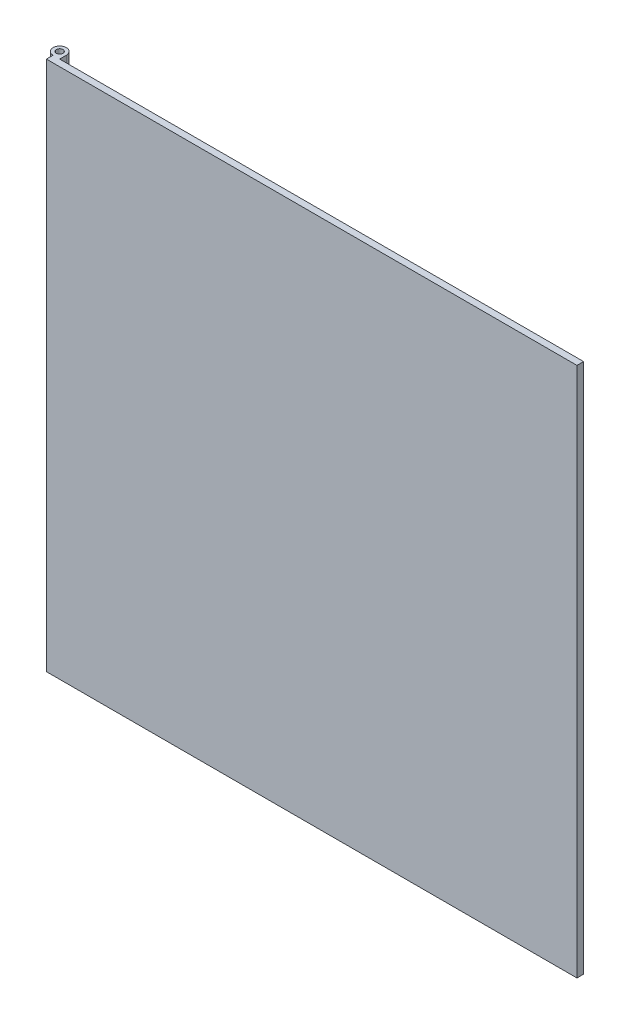
ISO-10303-21;
HEADER;
FILE_DESCRIPTION(('STEP AP214'),'2;1');
FILE_NAME('part.step','',(''),(''),'','','');
FILE_SCHEMA(('AUTOMOTIVE_DESIGN { 1 0 10303 214 1 1 1 1 }'));
ENDSEC;
DATA;
#1=APPLICATION_CONTEXT('core data for automotive mechanical design processes');
#2=APPLICATION_PROTOCOL_DEFINITION('international standard','automotive_design',2000,#1);
#3=PRODUCT_CONTEXT('',#1,'mechanical');
#4=PRODUCT('Part','Part','',(#3));
#5=PRODUCT_RELATED_PRODUCT_CATEGORY('part','',(#4));
#6=PRODUCT_DEFINITION_FORMATION('','',#4);
#7=PRODUCT_DEFINITION_CONTEXT('part definition',#1,'design');
#8=PRODUCT_DEFINITION('design','',#6,#7);
#9=PRODUCT_DEFINITION_SHAPE('','',#8);
#10=(LENGTH_UNIT() NAMED_UNIT(*) SI_UNIT(.MILLI.,.METRE.));
#11=(NAMED_UNIT(*) PLANE_ANGLE_UNIT() SI_UNIT($,.RADIAN.));
#12=(NAMED_UNIT(*) SI_UNIT($,.STERADIAN.) SOLID_ANGLE_UNIT());
#13=UNCERTAINTY_MEASURE_WITH_UNIT(LENGTH_MEASURE(1.E-05),#10,'distance_accuracy_value','');
#14=(GEOMETRIC_REPRESENTATION_CONTEXT(3) GLOBAL_UNCERTAINTY_ASSIGNED_CONTEXT((#13)) GLOBAL_UNIT_ASSIGNED_CONTEXT((#10,
#11,#12)) REPRESENTATION_CONTEXT('',''));
#15=CARTESIAN_POINT('',(0.,0.,0.));
#16=DIRECTION('',(0.,0.,1.));
#17=DIRECTION('',(1.,0.,0.));
#18=AXIS2_PLACEMENT_3D('',#15,#16,#17);
#19=CARTESIAN_POINT('',(0.,0.,1.));
#20=DIRECTION('',(1.,0.,0.));
#21=DIRECTION('',(0.,0.,-1.));
#22=AXIS2_PLACEMENT_3D('',#19,#20,#21);
#23=PLANE('',#22);
#24=DIRECTION('',(0.,-1.,0.));
#25=VECTOR('',#24,1.);
#26=CARTESIAN_POINT('',(0.,0.,0.));
#27=LINE('',#26,#25);
#28=CARTESIAN_POINT('',(0.,80.,0.));
#29=VERTEX_POINT('',#28);
#30=CARTESIAN_POINT('',(0.,0.,0.));
#31=VERTEX_POINT('',#30);
#32=EDGE_CURVE('E98',#29,#31,#27,.T.);
#33=ORIENTED_EDGE('',*,*,#32,.T.);
#34=DIRECTION('',(0.,0.,-1.));
#35=VECTOR('',#34,1.);
#36=CARTESIAN_POINT('',(0.,0.,1.));
#37=LINE('',#36,#35);
#38=CARTESIAN_POINT('',(0.,0.,1.));
#39=VERTEX_POINT('',#38);
#40=EDGE_CURVE('E11',#39,#31,#37,.T.);
#41=ORIENTED_EDGE('',*,*,#40,.F.);
#42=DIRECTION('',(0.,-1.,0.));
#43=VECTOR('',#42,1.);
#44=CARTESIAN_POINT('',(0.,0.,1.));
#45=LINE('',#44,#43);
#46=CARTESIAN_POINT('',(0.,80.,1.));
#47=VERTEX_POINT('',#46);
#48=EDGE_CURVE('E120',#47,#39,#45,.T.);
#49=ORIENTED_EDGE('',*,*,#48,.F.);
#50=DIRECTION('',(0.,0.,-1.));
#51=VECTOR('',#50,1.);
#52=CARTESIAN_POINT('',(0.,80.,1.));
#53=LINE('',#52,#51);
#54=EDGE_CURVE('E115',#47,#29,#53,.T.);
#55=ORIENTED_EDGE('',*,*,#54,.T.);
#56=EDGE_LOOP('',(#33,#41,#49,#55));
#57=FACE_BOUND('',#56,.T.);
#58=ADVANCED_FACE('F35',(#57),#23,.F.);
#59=CARTESIAN_POINT('',(0.,0.,1.));
#60=DIRECTION('',(0.,1.,0.));
#61=DIRECTION('',(0.,0.,1.));
#62=AXIS2_PLACEMENT_3D('',#59,#60,#61);
#63=PLANE('',#62);
#64=ORIENTED_EDGE('',*,*,#40,.T.);
#65=CARTESIAN_POINT('',(0.,0.,-1.));
#66=DIRECTION('',(0.,1.,0.));
#67=DIRECTION('',(0.,0.,1.));
#68=AXIS2_PLACEMENT_3D('',#65,#66,#67);
#69=CIRCLE('',#68,1.);
#70=CARTESIAN_POINT('',(1.,0.,-1.));
#71=VERTEX_POINT('',#70);
#72=EDGE_CURVE('E104',#31,#71,#69,.F.);
#73=ORIENTED_EDGE('',*,*,#72,.T.);
#74=DIRECTION('',(0.,0.,1.));
#75=VECTOR('',#74,1.);
#76=CARTESIAN_POINT('',(1.,0.,0.));
#77=LINE('',#76,#75);
#78=CARTESIAN_POINT('',(1.,0.,0.));
#79=VERTEX_POINT('',#78);
#80=EDGE_CURVE('E145',#71,#79,#77,.T.);
#81=ORIENTED_EDGE('',*,*,#80,.T.);
#82=DIRECTION('',(1.,0.,0.));
#83=VECTOR('',#82,1.);
#84=CARTESIAN_POINT('',(0.,0.,0.));
#85=LINE('',#84,#83);
#86=CARTESIAN_POINT('',(80.,0.,0.));
#87=VERTEX_POINT('',#86);
#88=EDGE_CURVE('E108',#79,#87,#85,.T.);
#89=ORIENTED_EDGE('',*,*,#88,.T.);
#90=DIRECTION('',(0.,0.,-1.));
#91=VECTOR('',#90,1.);
#92=CARTESIAN_POINT('',(80.,0.,1.));
#93=LINE('',#92,#91);
#94=CARTESIAN_POINT('',(80.,0.,1.));
#95=VERTEX_POINT('',#94);
#96=EDGE_CURVE('E42',#95,#87,#93,.T.);
#97=ORIENTED_EDGE('',*,*,#96,.F.);
#98=DIRECTION('',(1.,0.,0.));
#99=VECTOR('',#98,1.);
#100=CARTESIAN_POINT('',(0.,0.,1.));
#101=LINE('',#100,#99);
#102=EDGE_CURVE('E81',#39,#95,#101,.T.);
#103=ORIENTED_EDGE('',*,*,#102,.F.);
#104=EDGE_LOOP('',(#64,#73,#81,#89,#97,#103));
#105=FACE_BOUND('',#104,.T.);
#106=CARTESIAN_POINT('',(0.,0.,-1.));
#107=DIRECTION('',(0.,1.,0.));
#108=DIRECTION('',(0.,0.,1.));
#109=AXIS2_PLACEMENT_3D('',#106,#107,#108);
#110=CIRCLE('',#109,0.5);
#111=CARTESIAN_POINT('',(0.,0.,-0.5));
#112=VERTEX_POINT('',#111);
#113=EDGE_CURVE('E109',#112,#112,#110,.F.);
#114=ORIENTED_EDGE('',*,*,#113,.F.);
#115=EDGE_LOOP('',(#114));
#116=FACE_BOUND('',#115,.T.);
#117=ADVANCED_FACE('F150',(#105,#116),#63,.F.);
#118=CARTESIAN_POINT('',(80.,0.,1.));
#119=DIRECTION('',(-1.,0.,0.));
#120=DIRECTION('',(0.,0.,1.));
#121=AXIS2_PLACEMENT_3D('',#118,#119,#120);
#122=PLANE('',#121);
#123=DIRECTION('',(0.,1.,0.));
#124=VECTOR('',#123,1.);
#125=CARTESIAN_POINT('',(80.,0.,0.));
#126=LINE('',#125,#124);
#127=CARTESIAN_POINT('',(80.,80.,0.));
#128=VERTEX_POINT('',#127);
#129=EDGE_CURVE('E74',#87,#128,#126,.T.);
#130=ORIENTED_EDGE('',*,*,#129,.T.);
#131=DIRECTION('',(0.,0.,-1.));
#132=VECTOR('',#131,1.);
#133=CARTESIAN_POINT('',(80.,80.,1.));
#134=LINE('',#133,#132);
#135=CARTESIAN_POINT('',(80.,80.,1.));
#136=VERTEX_POINT('',#135);
#137=EDGE_CURVE('E121',#136,#128,#134,.T.);
#138=ORIENTED_EDGE('',*,*,#137,.F.);
#139=DIRECTION('',(0.,1.,0.));
#140=VECTOR('',#139,1.);
#141=CARTESIAN_POINT('',(80.,0.,1.));
#142=LINE('',#141,#140);
#143=EDGE_CURVE('E124',#95,#136,#142,.T.);
#144=ORIENTED_EDGE('',*,*,#143,.F.);
#145=ORIENTED_EDGE('',*,*,#96,.T.);
#146=EDGE_LOOP('',(#130,#138,#144,#145));
#147=FACE_BOUND('',#146,.T.);
#148=ADVANCED_FACE('F130',(#147),#122,.F.);
#149=CARTESIAN_POINT('',(0.,80.,1.));
#150=DIRECTION('',(0.,-1.,0.));
#151=DIRECTION('',(0.,0.,-1.));
#152=AXIS2_PLACEMENT_3D('',#149,#150,#151);
#153=PLANE('',#152);
#154=DIRECTION('',(-1.,0.,0.));
#155=VECTOR('',#154,1.);
#156=CARTESIAN_POINT('',(0.,80.,0.));
#157=LINE('',#156,#155);
#158=CARTESIAN_POINT('',(1.,80.,0.));
#159=VERTEX_POINT('',#158);
#160=EDGE_CURVE('E127',#128,#159,#157,.T.);
#161=ORIENTED_EDGE('',*,*,#160,.T.);
#162=DIRECTION('',(0.,0.,-1.));
#163=VECTOR('',#162,1.);
#164=CARTESIAN_POINT('',(1.,80.,0.));
#165=LINE('',#164,#163);
#166=CARTESIAN_POINT('',(1.,80.,-1.));
#167=VERTEX_POINT('',#166);
#168=EDGE_CURVE('E117',#159,#167,#165,.T.);
#169=ORIENTED_EDGE('',*,*,#168,.T.);
#170=CARTESIAN_POINT('',(0.,80.,-1.));
#171=DIRECTION('',(0.,1.,0.));
#172=DIRECTION('',(0.,0.,-1.));
#173=AXIS2_PLACEMENT_3D('',#170,#171,#172);
#174=CIRCLE('',#173,1.);
#175=EDGE_CURVE('E102',#167,#29,#174,.T.);
#176=ORIENTED_EDGE('',*,*,#175,.T.);
#177=ORIENTED_EDGE('',*,*,#54,.F.);
#178=DIRECTION('',(-1.,0.,0.));
#179=VECTOR('',#178,1.);
#180=CARTESIAN_POINT('',(0.,80.,1.));
#181=LINE('',#180,#179);
#182=EDGE_CURVE('E58',#136,#47,#181,.T.);
#183=ORIENTED_EDGE('',*,*,#182,.F.);
#184=ORIENTED_EDGE('',*,*,#137,.T.);
#185=EDGE_LOOP('',(#161,#169,#176,#177,#183,#184));
#186=FACE_BOUND('',#185,.T.);
#187=CARTESIAN_POINT('',(0.,80.,-1.));
#188=DIRECTION('',(0.,1.,0.));
#189=DIRECTION('',(0.,0.,1.));
#190=AXIS2_PLACEMENT_3D('',#187,#188,#189);
#191=CIRCLE('',#190,0.5);
#192=CARTESIAN_POINT('',(0.,80.,-0.5));
#193=VERTEX_POINT('',#192);
#194=EDGE_CURVE('E118',#193,#193,#191,.T.);
#195=ORIENTED_EDGE('',*,*,#194,.F.);
#196=EDGE_LOOP('',(#195));
#197=FACE_BOUND('',#196,.T.);
#198=ADVANCED_FACE('F113',(#186,#197),#153,.F.);
#199=CARTESIAN_POINT('',(0.,0.,1.));
#200=DIRECTION('',(0.,0.,-1.));
#201=DIRECTION('',(-1.,0.,0.));
#202=AXIS2_PLACEMENT_3D('',#199,#200,#201);
#203=PLANE('',#202);
#204=ORIENTED_EDGE('',*,*,#48,.T.);
#205=ORIENTED_EDGE('',*,*,#102,.T.);
#206=ORIENTED_EDGE('',*,*,#143,.T.);
#207=ORIENTED_EDGE('',*,*,#182,.T.);
#208=EDGE_LOOP('',(#204,#205,#206,#207));
#209=FACE_BOUND('',#208,.T.);
#210=ADVANCED_FACE('F162',(#209),#203,.F.);
#211=CARTESIAN_POINT('',(0.,0.,0.));
#212=DIRECTION('',(0.,0.,-1.));
#213=DIRECTION('',(-1.,0.,0.));
#214=AXIS2_PLACEMENT_3D('',#211,#212,#213);
#215=PLANE('',#214);
#216=DIRECTION('',(0.,1.,0.));
#217=VECTOR('',#216,1.);
#218=CARTESIAN_POINT('',(1.,-2.82842712474618,0.));
#219=LINE('',#218,#217);
#220=EDGE_CURVE('E49',#79,#159,#219,.T.);
#221=ORIENTED_EDGE('',*,*,#220,.T.);
#222=ORIENTED_EDGE('',*,*,#160,.F.);
#223=ORIENTED_EDGE('',*,*,#129,.F.);
#224=ORIENTED_EDGE('',*,*,#88,.F.);
#225=EDGE_LOOP('',(#221,#222,#223,#224));
#226=FACE_BOUND('',#225,.T.);
#227=ADVANCED_FACE('F134',(#226),#215,.T.);
#228=CARTESIAN_POINT('',(1.,-2.82842712474618,0.));
#229=DIRECTION('',(1.,0.,0.));
#230=DIRECTION('',(0.,0.,-1.));
#231=AXIS2_PLACEMENT_3D('',#228,#229,#230);
#232=PLANE('',#231);
#233=ORIENTED_EDGE('',*,*,#80,.F.);
#234=DIRECTION('',(0.,1.,0.));
#235=VECTOR('',#234,1.);
#236=CARTESIAN_POINT('',(1.,-2.82842712474618,-1.));
#237=LINE('',#236,#235);
#238=EDGE_CURVE('E143',#71,#167,#237,.T.);
#239=ORIENTED_EDGE('',*,*,#238,.T.);
#240=ORIENTED_EDGE('',*,*,#168,.F.);
#241=ORIENTED_EDGE('',*,*,#220,.F.);
#242=EDGE_LOOP('',(#233,#239,#240,#241));
#243=FACE_BOUND('',#242,.T.);
#244=ADVANCED_FACE('F152',(#243),#232,.T.);
#245=CARTESIAN_POINT('',(0.,-2.82842712474618,-1.));
#246=DIRECTION('',(0.,1.,0.));
#247=DIRECTION('',(0.,0.,1.));
#248=AXIS2_PLACEMENT_3D('',#245,#246,#247);
#249=CYLINDRICAL_SURFACE('',#248,1.);
#250=ORIENTED_EDGE('',*,*,#72,.F.);
#251=ORIENTED_EDGE('',*,*,#32,.F.);
#252=ORIENTED_EDGE('',*,*,#175,.F.);
#253=ORIENTED_EDGE('',*,*,#238,.F.);
#254=EDGE_LOOP('',(#250,#251,#252,#253));
#255=FACE_BOUND('',#254,.T.);
#256=ADVANCED_FACE('F100',(#255),#249,.T.);
#257=CARTESIAN_POINT('',(0.,-2.82842712474618,-1.));
#258=DIRECTION('',(0.,1.,0.));
#259=DIRECTION('',(0.,0.,1.));
#260=AXIS2_PLACEMENT_3D('',#257,#258,#259);
#261=CYLINDRICAL_SURFACE('',#260,0.5);
#262=ORIENTED_EDGE('',*,*,#113,.T.);
#263=EDGE_LOOP('',(#262));
#264=FACE_BOUND('',#263,.T.);
#265=ORIENTED_EDGE('',*,*,#194,.T.);
#266=EDGE_LOOP('',(#265));
#267=FACE_BOUND('',#266,.T.);
#268=ADVANCED_FACE('F159',(#264,#267),#261,.F.);
#269=CLOSED_SHELL('',(#58,#117,#148,#198,#210,#227,#244,#256,#268));
#270=MANIFOLD_SOLID_BREP('B2',#269);
#271=ADVANCED_BREP_SHAPE_REPRESENTATION('',(#18,#270),#14);
#272=SHAPE_DEFINITION_REPRESENTATION(#9,#271);
ENDSEC;
END-ISO-10303-21;
